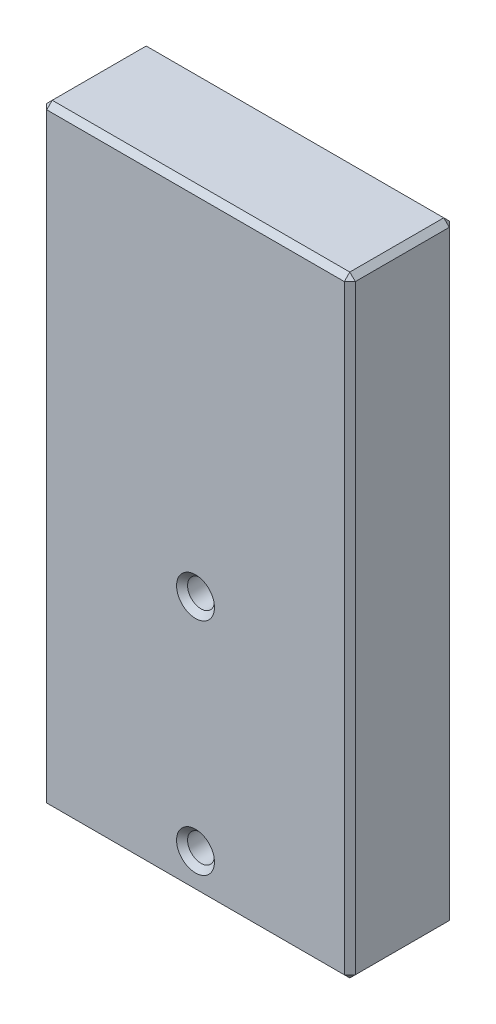
ISO-10303-21;
HEADER;
FILE_DESCRIPTION(('STEP AP214'),'2;1');
FILE_NAME('part.step','',(''),(''),'','','');
FILE_SCHEMA(('AUTOMOTIVE_DESIGN { 1 0 10303 214 1 1 1 1 }'));
ENDSEC;
DATA;
#1=APPLICATION_CONTEXT('core data for automotive mechanical design processes');
#2=APPLICATION_PROTOCOL_DEFINITION('international standard','automotive_design',2000,#1);
#3=PRODUCT_CONTEXT('',#1,'mechanical');
#4=PRODUCT('Part','Part','',(#3));
#5=PRODUCT_RELATED_PRODUCT_CATEGORY('part','',(#4));
#6=PRODUCT_DEFINITION_FORMATION('','',#4);
#7=PRODUCT_DEFINITION_CONTEXT('part definition',#1,'design');
#8=PRODUCT_DEFINITION('design','',#6,#7);
#9=PRODUCT_DEFINITION_SHAPE('','',#8);
#10=(LENGTH_UNIT() NAMED_UNIT(*) SI_UNIT(.MILLI.,.METRE.));
#11=(NAMED_UNIT(*) PLANE_ANGLE_UNIT() SI_UNIT($,.RADIAN.));
#12=(NAMED_UNIT(*) SI_UNIT($,.STERADIAN.) SOLID_ANGLE_UNIT());
#13=UNCERTAINTY_MEASURE_WITH_UNIT(LENGTH_MEASURE(1.E-05),#10,'distance_accuracy_value','');
#14=(GEOMETRIC_REPRESENTATION_CONTEXT(3) GLOBAL_UNCERTAINTY_ASSIGNED_CONTEXT((#13)) GLOBAL_UNIT_ASSIGNED_CONTEXT((#10,
#11,#12)) REPRESENTATION_CONTEXT('',''));
#15=CARTESIAN_POINT('',(0.,0.,0.));
#16=DIRECTION('',(0.,0.,1.));
#17=DIRECTION('',(1.,0.,0.));
#18=AXIS2_PLACEMENT_3D('',#15,#16,#17);
#19=CARTESIAN_POINT('',(0.,0.,9.525));
#20=DIRECTION('',(1.,0.,0.));
#21=DIRECTION('',(0.,0.,-1.));
#22=AXIS2_PLACEMENT_3D('',#19,#20,#21);
#23=PLANE('',#22);
#24=DIRECTION('',(0.,-1.,0.));
#25=VECTOR('',#24,1.);
#26=CARTESIAN_POINT('',(0.,0.,0.5));
#27=LINE('',#26,#25);
#28=CARTESIAN_POINT('',(0.,54.975,0.5));
#29=VERTEX_POINT('',#28);
#30=CARTESIAN_POINT('',(0.,0.5,0.5));
#31=VERTEX_POINT('',#30);
#32=EDGE_CURVE('E47',#29,#31,#27,.T.);
#33=ORIENTED_EDGE('',*,*,#32,.T.);
#34=DIRECTION('',(0.,0.,1.));
#35=VECTOR('',#34,1.);
#36=CARTESIAN_POINT('',(0.,0.5,9.525));
#37=LINE('',#36,#35);
#38=CARTESIAN_POINT('',(0.,0.5,9.025));
#39=VERTEX_POINT('',#38);
#40=EDGE_CURVE('E205',#31,#39,#37,.T.);
#41=ORIENTED_EDGE('',*,*,#40,.T.);
#42=DIRECTION('',(0.,1.,0.));
#43=VECTOR('',#42,1.);
#44=CARTESIAN_POINT('',(0.,0.,9.025));
#45=LINE('',#44,#43);
#46=CARTESIAN_POINT('',(0.,54.975,9.025));
#47=VERTEX_POINT('',#46);
#48=EDGE_CURVE('E201',#39,#47,#45,.T.);
#49=ORIENTED_EDGE('',*,*,#48,.T.);
#50=DIRECTION('',(0.,0.,-1.));
#51=VECTOR('',#50,1.);
#52=CARTESIAN_POINT('',(0.,54.975,9.525));
#53=LINE('',#52,#51);
#54=EDGE_CURVE('E52',#47,#29,#53,.T.);
#55=ORIENTED_EDGE('',*,*,#54,.T.);
#56=EDGE_LOOP('',(#33,#41,#49,#55));
#57=FACE_BOUND('',#56,.T.);
#58=ADVANCED_FACE('F32',(#57),#23,.F.);
#59=CARTESIAN_POINT('',(0.,0.,9.525));
#60=DIRECTION('',(0.,1.,0.));
#61=DIRECTION('',(0.,0.,1.));
#62=AXIS2_PLACEMENT_3D('',#59,#60,#61);
#63=PLANE('',#62);
#64=CARTESIAN_POINT('',(23.,0.,4.7625));
#65=DIRECTION('',(0.,1.,0.));
#66=DIRECTION('',(0.,0.,1.));
#67=AXIS2_PLACEMENT_3D('',#64,#65,#66);
#68=CIRCLE('',#67,1.71949999999999);
#69=CARTESIAN_POINT('',(23.,0.,6.48199999999999));
#70=VERTEX_POINT('',#69);
#71=EDGE_CURVE('E266',#70,#70,#68,.T.);
#72=ORIENTED_EDGE('',*,*,#71,.T.);
#73=EDGE_LOOP('',(#72));
#74=FACE_BOUND('',#73,.T.);
#75=CARTESIAN_POINT('',(5.,0.,4.7625));
#76=DIRECTION('',(0.,1.,0.));
#77=DIRECTION('',(0.,0.,1.));
#78=AXIS2_PLACEMENT_3D('',#75,#76,#77);
#79=CIRCLE('',#78,1.71949999999999);
#80=CARTESIAN_POINT('',(5.,0.,6.48199999999999));
#81=VERTEX_POINT('',#80);
#82=EDGE_CURVE('E263',#81,#81,#79,.T.);
#83=ORIENTED_EDGE('',*,*,#82,.T.);
#84=EDGE_LOOP('',(#83));
#85=FACE_BOUND('',#84,.T.);
#86=DIRECTION('',(0.,0.,-1.));
#87=VECTOR('',#86,1.);
#88=CARTESIAN_POINT('',(0.499999999999994,0.,9.525));
#89=LINE('',#88,#87);
#90=CARTESIAN_POINT('',(0.499999999999994,0.,9.025));
#91=VERTEX_POINT('',#90);
#92=CARTESIAN_POINT('',(0.499999999999994,0.,0.499999999999994));
#93=VERTEX_POINT('',#92);
#94=EDGE_CURVE('E125',#91,#93,#89,.T.);
#95=ORIENTED_EDGE('',*,*,#94,.T.);
#96=DIRECTION('',(1.,0.,0.));
#97=VECTOR('',#96,1.);
#98=CARTESIAN_POINT('',(28.,0.,0.499999999999994));
#99=LINE('',#98,#97);
#100=CARTESIAN_POINT('',(27.5,0.,0.499999999999994));
#101=VERTEX_POINT('',#100);
#102=EDGE_CURVE('E164',#93,#101,#99,.T.);
#103=ORIENTED_EDGE('',*,*,#102,.T.);
#104=DIRECTION('',(0.,0.,1.));
#105=VECTOR('',#104,1.);
#106=CARTESIAN_POINT('',(27.5,0.,9.525));
#107=LINE('',#106,#105);
#108=CARTESIAN_POINT('',(27.5,0.,9.025));
#109=VERTEX_POINT('',#108);
#110=EDGE_CURVE('E128',#101,#109,#107,.T.);
#111=ORIENTED_EDGE('',*,*,#110,.T.);
#112=DIRECTION('',(-1.,0.,0.));
#113=VECTOR('',#112,1.);
#114=CARTESIAN_POINT('',(0.,0.,9.025));
#115=LINE('',#114,#113);
#116=EDGE_CURVE('E120',#109,#91,#115,.T.);
#117=ORIENTED_EDGE('',*,*,#116,.T.);
#118=EDGE_LOOP('',(#95,#103,#111,#117));
#119=FACE_BOUND('',#118,.T.);
#120=ADVANCED_FACE('F122',(#74,#85,#119),#63,.F.);
#121=CARTESIAN_POINT('',(28.,0.,9.525));
#122=DIRECTION('',(-1.,0.,0.));
#123=DIRECTION('',(0.,0.,1.));
#124=AXIS2_PLACEMENT_3D('',#121,#122,#123);
#125=PLANE('',#124);
#126=DIRECTION('',(0.,-1.,0.));
#127=VECTOR('',#126,1.);
#128=CARTESIAN_POINT('',(28.,0.,9.025));
#129=LINE('',#128,#127);
#130=CARTESIAN_POINT('',(28.,54.975,9.025));
#131=VERTEX_POINT('',#130);
#132=CARTESIAN_POINT('',(28.,0.499999999999993,9.025));
#133=VERTEX_POINT('',#132);
#134=EDGE_CURVE('E175',#131,#133,#129,.T.);
#135=ORIENTED_EDGE('',*,*,#134,.T.);
#136=DIRECTION('',(0.,0.,-1.));
#137=VECTOR('',#136,1.);
#138=CARTESIAN_POINT('',(28.,0.499999999999993,9.525));
#139=LINE('',#138,#137);
#140=CARTESIAN_POINT('',(28.,0.499999999999993,0.499999999999994));
#141=VERTEX_POINT('',#140);
#142=EDGE_CURVE('E181',#133,#141,#139,.T.);
#143=ORIENTED_EDGE('',*,*,#142,.T.);
#144=DIRECTION('',(0.,1.,0.));
#145=VECTOR('',#144,1.);
#146=CARTESIAN_POINT('',(28.,55.475,0.499999999999994));
#147=LINE('',#146,#145);
#148=CARTESIAN_POINT('',(28.,54.975,0.499999999999994));
#149=VERTEX_POINT('',#148);
#150=EDGE_CURVE('E179',#141,#149,#147,.T.);
#151=ORIENTED_EDGE('',*,*,#150,.T.);
#152=DIRECTION('',(0.,0.,1.));
#153=VECTOR('',#152,1.);
#154=CARTESIAN_POINT('',(28.,54.975,9.525));
#155=LINE('',#154,#153);
#156=EDGE_CURVE('E177',#149,#131,#155,.T.);
#157=ORIENTED_EDGE('',*,*,#156,.T.);
#158=EDGE_LOOP('',(#135,#143,#151,#157));
#159=FACE_BOUND('',#158,.T.);
#160=ADVANCED_FACE('F321',(#159),#125,.F.);
#161=CARTESIAN_POINT('',(0.,55.475,9.525));
#162=DIRECTION('',(0.,-1.,0.));
#163=DIRECTION('',(0.,0.,-1.));
#164=AXIS2_PLACEMENT_3D('',#161,#162,#163);
#165=PLANE('',#164);
#166=DIRECTION('',(0.,0.,-1.));
#167=VECTOR('',#166,1.);
#168=CARTESIAN_POINT('',(27.5,55.475,9.525));
#169=LINE('',#168,#167);
#170=CARTESIAN_POINT('',(27.5,55.475,9.025));
#171=VERTEX_POINT('',#170);
#172=CARTESIAN_POINT('',(27.5,55.475,0.499999999999994));
#173=VERTEX_POINT('',#172);
#174=EDGE_CURVE('E188',#171,#173,#169,.T.);
#175=ORIENTED_EDGE('',*,*,#174,.T.);
#176=DIRECTION('',(-1.,0.,0.));
#177=VECTOR('',#176,1.);
#178=CARTESIAN_POINT('',(0.,55.475,0.499999999999994));
#179=LINE('',#178,#177);
#180=CARTESIAN_POINT('',(0.499999999999994,55.475,0.499999999999994));
#181=VERTEX_POINT('',#180);
#182=EDGE_CURVE('E190',#173,#181,#179,.T.);
#183=ORIENTED_EDGE('',*,*,#182,.T.);
#184=DIRECTION('',(0.,0.,1.));
#185=VECTOR('',#184,1.);
#186=CARTESIAN_POINT('',(0.499999999999994,55.475,9.525));
#187=LINE('',#186,#185);
#188=CARTESIAN_POINT('',(0.499999999999994,55.475,9.025));
#189=VERTEX_POINT('',#188);
#190=EDGE_CURVE('E184',#181,#189,#187,.T.);
#191=ORIENTED_EDGE('',*,*,#190,.T.);
#192=DIRECTION('',(1.,0.,0.));
#193=VECTOR('',#192,1.);
#194=CARTESIAN_POINT('',(0.,55.475,9.025));
#195=LINE('',#194,#193);
#196=EDGE_CURVE('E186',#189,#171,#195,.T.);
#197=ORIENTED_EDGE('',*,*,#196,.T.);
#198=EDGE_LOOP('',(#175,#183,#191,#197));
#199=FACE_BOUND('',#198,.T.);
#200=ADVANCED_FACE('F425',(#199),#165,.F.);
#201=CARTESIAN_POINT('',(0.,55.475,9.525));
#202=DIRECTION('',(0.,0.,-1.));
#203=DIRECTION('',(-1.,0.,0.));
#204=AXIS2_PLACEMENT_3D('',#201,#202,#203);
#205=PLANE('',#204);
#206=CARTESIAN_POINT('',(14.,3.475,9.525));
#207=DIRECTION('',(0.,0.,-1.));
#208=DIRECTION('',(-1.,0.,0.));
#209=AXIS2_PLACEMENT_3D('',#206,#207,#208);
#210=CIRCLE('',#209,1.71950000000003);
#211=CARTESIAN_POINT('',(12.2805,3.475,9.525));
#212=VERTEX_POINT('',#211);
#213=EDGE_CURVE('E11',#212,#212,#210,.T.);
#214=ORIENTED_EDGE('',*,*,#213,.T.);
#215=EDGE_LOOP('',(#214));
#216=FACE_BOUND('',#215,.T.);
#217=CARTESIAN_POINT('',(14.,23.475,9.525));
#218=DIRECTION('',(0.,0.,-1.));
#219=DIRECTION('',(-1.,0.,0.));
#220=AXIS2_PLACEMENT_3D('',#217,#218,#219);
#221=CIRCLE('',#220,1.71950000000003);
#222=CARTESIAN_POINT('',(12.2805,23.475,9.525));
#223=VERTEX_POINT('',#222);
#224=EDGE_CURVE('E40',#223,#223,#221,.T.);
#225=ORIENTED_EDGE('',*,*,#224,.T.);
#226=EDGE_LOOP('',(#225));
#227=FACE_BOUND('',#226,.T.);
#228=DIRECTION('',(1.,0.,0.));
#229=VECTOR('',#228,1.);
#230=CARTESIAN_POINT('',(0.,0.499999999999994,9.525));
#231=LINE('',#230,#229);
#232=CARTESIAN_POINT('',(0.499999999999994,0.499999999999994,9.525));
#233=VERTEX_POINT('',#232);
#234=CARTESIAN_POINT('',(27.5,0.499999999999994,9.525));
#235=VERTEX_POINT('',#234);
#236=EDGE_CURVE('E138',#233,#235,#231,.T.);
#237=ORIENTED_EDGE('',*,*,#236,.T.);
#238=DIRECTION('',(0.,1.,0.));
#239=VECTOR('',#238,1.);
#240=CARTESIAN_POINT('',(27.5,55.475,9.525));
#241=LINE('',#240,#239);
#242=CARTESIAN_POINT('',(27.5,54.975,9.525));
#243=VERTEX_POINT('',#242);
#244=EDGE_CURVE('E198',#235,#243,#241,.T.);
#245=ORIENTED_EDGE('',*,*,#244,.T.);
#246=DIRECTION('',(-1.,0.,0.));
#247=VECTOR('',#246,1.);
#248=CARTESIAN_POINT('',(0.,54.975,9.525));
#249=LINE('',#248,#247);
#250=CARTESIAN_POINT('',(0.499999999999994,54.975,9.525));
#251=VERTEX_POINT('',#250);
#252=EDGE_CURVE('E196',#243,#251,#249,.T.);
#253=ORIENTED_EDGE('',*,*,#252,.T.);
#254=DIRECTION('',(0.,-1.,0.));
#255=VECTOR('',#254,1.);
#256=CARTESIAN_POINT('',(0.499999999999994,55.475,9.525));
#257=LINE('',#256,#255);
#258=EDGE_CURVE('E193',#251,#233,#257,.T.);
#259=ORIENTED_EDGE('',*,*,#258,.T.);
#260=EDGE_LOOP('',(#237,#245,#253,#259));
#261=FACE_BOUND('',#260,.T.);
#262=ADVANCED_FACE('F292',(#216,#227,#261),#205,.F.);
#263=CARTESIAN_POINT('',(0.,55.475,0.));
#264=DIRECTION('',(0.,0.,-1.));
#265=DIRECTION('',(-1.,0.,0.));
#266=AXIS2_PLACEMENT_3D('',#263,#264,#265);
#267=PLANE('',#266);
#268=CARTESIAN_POINT('',(14.,3.475,0.));
#269=DIRECTION('',(0.,0.,-1.));
#270=DIRECTION('',(-1.,0.,0.));
#271=AXIS2_PLACEMENT_3D('',#268,#269,#270);
#272=CIRCLE('',#271,1.71949999999996);
#273=CARTESIAN_POINT('',(12.2805,3.475,0.));
#274=VERTEX_POINT('',#273);
#275=EDGE_CURVE('E275',#274,#274,#272,.F.);
#276=ORIENTED_EDGE('',*,*,#275,.T.);
#277=EDGE_LOOP('',(#276));
#278=FACE_BOUND('',#277,.T.);
#279=CARTESIAN_POINT('',(14.,23.475,0.));
#280=DIRECTION('',(0.,0.,-1.));
#281=DIRECTION('',(-1.,0.,0.));
#282=AXIS2_PLACEMENT_3D('',#279,#280,#281);
#283=CIRCLE('',#282,1.71949999999996);
#284=CARTESIAN_POINT('',(12.2805,23.475,0.));
#285=VERTEX_POINT('',#284);
#286=EDGE_CURVE('E272',#285,#285,#283,.F.);
#287=ORIENTED_EDGE('',*,*,#286,.T.);
#288=EDGE_LOOP('',(#287));
#289=FACE_BOUND('',#288,.T.);
#290=DIRECTION('',(0.,-1.,0.));
#291=VECTOR('',#290,1.);
#292=CARTESIAN_POINT('',(27.5,0.,0.));
#293=LINE('',#292,#291);
#294=CARTESIAN_POINT('',(27.5,54.975,0.));
#295=VERTEX_POINT('',#294);
#296=CARTESIAN_POINT('',(27.5,0.5,0.));
#297=VERTEX_POINT('',#296);
#298=EDGE_CURVE('E170',#295,#297,#293,.T.);
#299=ORIENTED_EDGE('',*,*,#298,.T.);
#300=DIRECTION('',(-1.,0.,0.));
#301=VECTOR('',#300,1.);
#302=CARTESIAN_POINT('',(0.,0.5,0.));
#303=LINE('',#302,#301);
#304=CARTESIAN_POINT('',(0.499999999999994,0.5,0.));
#305=VERTEX_POINT('',#304);
#306=EDGE_CURVE('E172',#297,#305,#303,.T.);
#307=ORIENTED_EDGE('',*,*,#306,.T.);
#308=DIRECTION('',(0.,1.,0.));
#309=VECTOR('',#308,1.);
#310=CARTESIAN_POINT('',(0.499999999999994,55.475,0.));
#311=LINE('',#310,#309);
#312=CARTESIAN_POINT('',(0.499999999999994,54.975,0.));
#313=VERTEX_POINT('',#312);
#314=EDGE_CURVE('E166',#305,#313,#311,.T.);
#315=ORIENTED_EDGE('',*,*,#314,.T.);
#316=DIRECTION('',(1.,0.,0.));
#317=VECTOR('',#316,1.);
#318=CARTESIAN_POINT('',(28.,54.975,0.));
#319=LINE('',#318,#317);
#320=EDGE_CURVE('E168',#313,#295,#319,.T.);
#321=ORIENTED_EDGE('',*,*,#320,.T.);
#322=EDGE_LOOP('',(#299,#307,#315,#321));
#323=FACE_BOUND('',#322,.T.);
#324=ADVANCED_FACE('F424',(#278,#289,#323),#267,.T.);
#325=CARTESIAN_POINT('',(5.,20.,4.7625));
#326=DIRECTION('',(0.,-1.,0.));
#327=DIRECTION('',(0.,0.,-1.));
#328=AXIS2_PLACEMENT_3D('',#325,#326,#327);
#329=CYLINDRICAL_SURFACE('',#328,1.2195);
#330=CARTESIAN_POINT('',(5.,0.49999999999999,4.7625));
#331=DIRECTION('',(0.,1.,0.));
#332=DIRECTION('',(0.,0.,1.));
#333=AXIS2_PLACEMENT_3D('',#330,#331,#332);
#334=CIRCLE('',#333,1.2195);
#335=CARTESIAN_POINT('',(5.,0.49999999999999,5.982));
#336=VERTEX_POINT('',#335);
#337=EDGE_CURVE('E269',#336,#336,#334,.F.);
#338=ORIENTED_EDGE('',*,*,#337,.T.);
#339=EDGE_LOOP('',(#338));
#340=FACE_BOUND('',#339,.T.);
#341=CARTESIAN_POINT('',(5.,20.,4.7625));
#342=DIRECTION('',(0.,-1.,0.));
#343=DIRECTION('',(0.,0.,-1.));
#344=AXIS2_PLACEMENT_3D('',#341,#342,#343);
#345=CIRCLE('',#344,1.2195);
#346=CARTESIAN_POINT('',(5.,20.,3.543));
#347=VERTEX_POINT('',#346);
#348=EDGE_CURVE('E156',#347,#347,#345,.T.);
#349=ORIENTED_EDGE('',*,*,#348,.F.);
#350=EDGE_LOOP('',(#349));
#351=FACE_BOUND('',#350,.T.);
#352=ADVANCED_FACE('F431',(#340,#351),#329,.F.);
#353=CARTESIAN_POINT('',(5.,20.,4.7625));
#354=DIRECTION('',(0.,-1.,0.));
#355=DIRECTION('',(0.,0.,-1.));
#356=AXIS2_PLACEMENT_3D('',#353,#354,#355);
#357=PLANE('',#356);
#358=ORIENTED_EDGE('',*,*,#348,.T.);
#359=EDGE_LOOP('',(#358));
#360=FACE_BOUND('',#359,.T.);
#361=ADVANCED_FACE('F628',(#360),#357,.T.);
#362=CARTESIAN_POINT('',(23.,20.,4.7625));
#363=DIRECTION('',(0.,-1.,0.));
#364=DIRECTION('',(0.,0.,-1.));
#365=AXIS2_PLACEMENT_3D('',#362,#363,#364);
#366=CYLINDRICAL_SURFACE('',#365,1.2195);
#367=CARTESIAN_POINT('',(23.,0.49999999999999,4.7625));
#368=DIRECTION('',(0.,1.,0.));
#369=DIRECTION('',(0.,0.,1.));
#370=AXIS2_PLACEMENT_3D('',#367,#368,#369);
#371=CIRCLE('',#370,1.2195);
#372=CARTESIAN_POINT('',(23.,0.49999999999999,5.982));
#373=VERTEX_POINT('',#372);
#374=EDGE_CURVE('E207',#373,#373,#371,.F.);
#375=ORIENTED_EDGE('',*,*,#374,.T.);
#376=EDGE_LOOP('',(#375));
#377=FACE_BOUND('',#376,.T.);
#378=CARTESIAN_POINT('',(23.,20.,4.7625));
#379=DIRECTION('',(0.,-1.,0.));
#380=DIRECTION('',(0.,0.,-1.));
#381=AXIS2_PLACEMENT_3D('',#378,#379,#380);
#382=CIRCLE('',#381,1.2195);
#383=CARTESIAN_POINT('',(23.,20.,3.543));
#384=VERTEX_POINT('',#383);
#385=EDGE_CURVE('E159',#384,#384,#382,.T.);
#386=ORIENTED_EDGE('',*,*,#385,.F.);
#387=EDGE_LOOP('',(#386));
#388=FACE_BOUND('',#387,.T.);
#389=ADVANCED_FACE('F313',(#377,#388),#366,.F.);
#390=CARTESIAN_POINT('',(23.,20.,4.7625));
#391=DIRECTION('',(0.,-1.,0.));
#392=DIRECTION('',(0.,0.,-1.));
#393=AXIS2_PLACEMENT_3D('',#390,#391,#392);
#394=PLANE('',#393);
#395=ORIENTED_EDGE('',*,*,#385,.T.);
#396=EDGE_LOOP('',(#395));
#397=FACE_BOUND('',#396,.T.);
#398=ADVANCED_FACE('F303',(#397),#394,.T.);
#399=CARTESIAN_POINT('',(14.,23.475,0.));
#400=DIRECTION('',(0.,0.,1.));
#401=DIRECTION('',(1.,0.,0.));
#402=AXIS2_PLACEMENT_3D('',#399,#400,#401);
#403=CYLINDRICAL_SURFACE('',#402,1.2195);
#404=CARTESIAN_POINT('',(14.,23.475,0.499999999999958));
#405=DIRECTION('',(0.,0.,-1.));
#406=DIRECTION('',(-1.,0.,0.));
#407=AXIS2_PLACEMENT_3D('',#404,#405,#406);
#408=CIRCLE('',#407,1.2195);
#409=CARTESIAN_POINT('',(15.2195,23.475,0.499999999999958));
#410=VERTEX_POINT('',#409);
#411=EDGE_CURVE('E287',#410,#410,#408,.T.);
#412=CARTESIAN_POINT('',(14.,23.475,9.02499999999997));
#413=DIRECTION('',(0.,0.,-1.));
#414=DIRECTION('',(-1.,0.,0.));
#415=AXIS2_PLACEMENT_3D('',#412,#413,#414);
#416=CIRCLE('',#415,1.2195);
#417=CARTESIAN_POINT('',(15.2195,23.475,9.02499999999997));
#418=VERTEX_POINT('',#417);
#419=EDGE_CURVE('E284',#418,#418,#416,.F.);
#420=CARTESIAN_POINT('',(15.2195,23.475,0.499999999999958));
#421=CARTESIAN_POINT('',(15.2195,23.475,0.588802083333291));
#422=CARTESIAN_POINT('',(15.2195,23.475,0.677604166666625));
#423=CARTESIAN_POINT('',(15.2195,23.475,0.855208333333292));
#424=CARTESIAN_POINT('',(15.2195,23.475,0.944010416666625));
#425=CARTESIAN_POINT('',(15.2195,23.475,1.12161458333329));
#426=CARTESIAN_POINT('',(15.2195,23.475,1.21041666666663));
#427=CARTESIAN_POINT('',(15.2195,23.475,1.38802083333329));
#428=CARTESIAN_POINT('',(15.2195,23.475,1.47682291666663));
#429=CARTESIAN_POINT('',(15.2195,23.475,1.65442708333329));
#430=CARTESIAN_POINT('',(15.2195,23.475,1.74322916666663));
#431=CARTESIAN_POINT('',(15.2195,23.475,1.92083333333329));
#432=CARTESIAN_POINT('',(15.2195,23.475,2.00963541666663));
#433=CARTESIAN_POINT('',(15.2195,23.475,2.18723958333329));
#434=CARTESIAN_POINT('',(15.2195,23.475,2.27604166666663));
#435=CARTESIAN_POINT('',(15.2195,23.475,2.45364583333329));
#436=CARTESIAN_POINT('',(15.2195,23.475,2.54244791666663));
#437=CARTESIAN_POINT('',(15.2195,23.475,2.72005208333329));
#438=CARTESIAN_POINT('',(15.2195,23.475,2.80885416666663));
#439=CARTESIAN_POINT('',(15.2195,23.475,2.9864583333333));
#440=CARTESIAN_POINT('',(15.2195,23.475,3.07526041666663));
#441=CARTESIAN_POINT('',(15.2195,23.475,3.2528645833333));
#442=CARTESIAN_POINT('',(15.2195,23.475,3.34166666666663));
#443=CARTESIAN_POINT('',(15.2195,23.475,3.5192708333333));
#444=CARTESIAN_POINT('',(15.2195,23.475,3.60807291666663));
#445=CARTESIAN_POINT('',(15.2195,23.475,3.7856770833333));
#446=CARTESIAN_POINT('',(15.2195,23.475,3.87447916666663));
#447=CARTESIAN_POINT('',(15.2195,23.475,4.0520833333333));
#448=CARTESIAN_POINT('',(15.2195,23.475,4.14088541666663));
#449=CARTESIAN_POINT('',(15.2195,23.475,4.3184895833333));
#450=CARTESIAN_POINT('',(15.2195,23.475,4.40729166666663));
#451=CARTESIAN_POINT('',(15.2195,23.475,4.5848958333333));
#452=CARTESIAN_POINT('',(15.2195,23.475,4.67369791666663));
#453=CARTESIAN_POINT('',(15.2195,23.475,4.8513020833333));
#454=CARTESIAN_POINT('',(15.2195,23.475,4.94010416666663));
#455=CARTESIAN_POINT('',(15.2195,23.475,5.1177083333333));
#456=CARTESIAN_POINT('',(15.2195,23.475,5.20651041666663));
#457=CARTESIAN_POINT('',(15.2195,23.475,5.3841145833333));
#458=CARTESIAN_POINT('',(15.2195,23.475,5.47291666666663));
#459=CARTESIAN_POINT('',(15.2195,23.475,5.6505208333333));
#460=CARTESIAN_POINT('',(15.2195,23.475,5.73932291666663));
#461=CARTESIAN_POINT('',(15.2195,23.475,5.9169270833333));
#462=CARTESIAN_POINT('',(15.2195,23.475,6.00572916666663));
#463=CARTESIAN_POINT('',(15.2195,23.475,6.1833333333333));
#464=CARTESIAN_POINT('',(15.2195,23.475,6.27213541666663));
#465=CARTESIAN_POINT('',(15.2195,23.475,6.4497395833333));
#466=CARTESIAN_POINT('',(15.2195,23.475,6.53854166666663));
#467=CARTESIAN_POINT('',(15.2195,23.475,6.7161458333333));
#468=CARTESIAN_POINT('',(15.2195,23.475,6.80494791666664));
#469=CARTESIAN_POINT('',(15.2195,23.475,6.9825520833333));
#470=CARTESIAN_POINT('',(15.2195,23.475,7.07135416666664));
#471=CARTESIAN_POINT('',(15.2195,23.475,7.2489583333333));
#472=CARTESIAN_POINT('',(15.2195,23.475,7.33776041666664));
#473=CARTESIAN_POINT('',(15.2195,23.475,7.5153645833333));
#474=CARTESIAN_POINT('',(15.2195,23.475,7.60416666666664));
#475=CARTESIAN_POINT('',(15.2195,23.475,7.7817708333333));
#476=CARTESIAN_POINT('',(15.2195,23.475,7.87057291666664));
#477=CARTESIAN_POINT('',(15.2195,23.475,8.0481770833333));
#478=CARTESIAN_POINT('',(15.2195,23.475,8.13697916666664));
#479=CARTESIAN_POINT('',(15.2195,23.475,8.3145833333333));
#480=CARTESIAN_POINT('',(15.2195,23.475,8.40338541666664));
#481=CARTESIAN_POINT('',(15.2195,23.475,8.58098958333331));
#482=CARTESIAN_POINT('',(15.2195,23.475,8.66979166666664));
#483=CARTESIAN_POINT('',(15.2195,23.475,8.84739583333331));
#484=CARTESIAN_POINT('',(15.2195,23.475,8.93619791666664));
#485=CARTESIAN_POINT('',(15.2195,23.475,9.02499999999997));
#486=B_SPLINE_CURVE_WITH_KNOTS('',3,(#420,#421,#422,#423,#424,#425,#426,#427,#428,#429,#430,
#431,#432,#433,#434,#435,#436,#437,#438,#439,#440,#441,#442,#443,#444,#445,#446,#447,#448,#449,
#450,#451,#452,#453,#454,#455,#456,#457,#458,#459,#460,#461,#462,#463,#464,#465,#466,#467,#468,
#469,#470,#471,#472,#473,#474,#475,#476,#477,#478,#479,#480,#481,#482,#483,#484,#485),
.UNSPECIFIED.,.F.,.F.,(4,2,2,2,2,2,2,2,2,2,2,2,2,2,2,2,2,2,2,2,2,2,2,2,2,2,2,2,2,2,2,2,4),(0.,
0.26640625,0.532812500000001,0.799218750000001,1.065625,1.33203125,1.5984375,1.86484375,2.13125,
2.39765625,2.6640625,2.93046875000001,3.19687500000001,3.46328125000001,3.72968750000001,
3.99609375000001,4.26250000000001,4.52890625000001,4.79531250000001,5.06171875000001,
5.32812500000001,5.59453125000001,5.86093750000001,6.12734375000001,6.39375000000001,
6.66015625000001,6.92656250000001,7.19296875000001,7.45937500000001,7.72578125000001,
7.99218750000002,8.25859375000002,8.52500000000001),.UNSPECIFIED.);
#487=EDGE_CURVE('BSEAM300',#410,#418,#486,.T.);
#488=ORIENTED_EDGE('',*,*,#411,.T.);
#489=ORIENTED_EDGE('',*,*,#419,.T.);
#490=ORIENTED_EDGE('',*,*,#487,.T.);
#491=ORIENTED_EDGE('',*,*,#487,.F.);
#492=EDGE_LOOP('',(#488,#490,#489,#491));
#493=FACE_BOUND('',#492,.T.);
#494=ADVANCED_FACE('F300',(#493),#403,.F.);
#495=CARTESIAN_POINT('',(14.,3.475,0.));
#496=DIRECTION('',(0.,0.,1.));
#497=DIRECTION('',(1.,0.,0.));
#498=AXIS2_PLACEMENT_3D('',#495,#496,#497);
#499=CYLINDRICAL_SURFACE('',#498,1.2195);
#500=CARTESIAN_POINT('',(14.,3.475,0.499999999999959));
#501=DIRECTION('',(0.,0.,-1.));
#502=DIRECTION('',(-1.,0.,0.));
#503=AXIS2_PLACEMENT_3D('',#500,#501,#502);
#504=CIRCLE('',#503,1.2195);
#505=CARTESIAN_POINT('',(15.2195,3.475,0.499999999999959));
#506=VERTEX_POINT('',#505);
#507=EDGE_CURVE('E281',#506,#506,#504,.T.);
#508=CARTESIAN_POINT('',(14.,3.475,9.02499999999997));
#509=DIRECTION('',(0.,0.,-1.));
#510=DIRECTION('',(-1.,0.,0.));
#511=AXIS2_PLACEMENT_3D('',#508,#509,#510);
#512=CIRCLE('',#511,1.2195);
#513=CARTESIAN_POINT('',(15.2195,3.475,9.02499999999997));
#514=VERTEX_POINT('',#513);
#515=EDGE_CURVE('E278',#514,#514,#512,.F.);
#516=CARTESIAN_POINT('',(15.2195,3.475,0.499999999999959));
#517=CARTESIAN_POINT('',(15.2195,3.475,0.588802083333293));
#518=CARTESIAN_POINT('',(15.2195,3.475,0.677604166666626));
#519=CARTESIAN_POINT('',(15.2195,3.475,0.855208333333293));
#520=CARTESIAN_POINT('',(15.2195,3.475,0.944010416666627));
#521=CARTESIAN_POINT('',(15.2195,3.475,1.12161458333329));
#522=CARTESIAN_POINT('',(15.2195,3.475,1.21041666666663));
#523=CARTESIAN_POINT('',(15.2195,3.475,1.38802083333329));
#524=CARTESIAN_POINT('',(15.2195,3.475,1.47682291666663));
#525=CARTESIAN_POINT('',(15.2195,3.475,1.65442708333329));
#526=CARTESIAN_POINT('',(15.2195,3.475,1.74322916666663));
#527=CARTESIAN_POINT('',(15.2195,3.475,1.92083333333329));
#528=CARTESIAN_POINT('',(15.2195,3.475,2.00963541666663));
#529=CARTESIAN_POINT('',(15.2195,3.475,2.1872395833333));
#530=CARTESIAN_POINT('',(15.2195,3.475,2.27604166666663));
#531=CARTESIAN_POINT('',(15.2195,3.475,2.4536458333333));
#532=CARTESIAN_POINT('',(15.2195,3.475,2.54244791666663));
#533=CARTESIAN_POINT('',(15.2195,3.475,2.7200520833333));
#534=CARTESIAN_POINT('',(15.2195,3.475,2.80885416666663));
#535=CARTESIAN_POINT('',(15.2195,3.475,2.9864583333333));
#536=CARTESIAN_POINT('',(15.2195,3.475,3.07526041666663));
#537=CARTESIAN_POINT('',(15.2195,3.475,3.2528645833333));
#538=CARTESIAN_POINT('',(15.2195,3.475,3.34166666666663));
#539=CARTESIAN_POINT('',(15.2195,3.475,3.5192708333333));
#540=CARTESIAN_POINT('',(15.2195,3.475,3.60807291666663));
#541=CARTESIAN_POINT('',(15.2195,3.475,3.7856770833333));
#542=CARTESIAN_POINT('',(15.2195,3.475,3.87447916666663));
#543=CARTESIAN_POINT('',(15.2195,3.475,4.0520833333333));
#544=CARTESIAN_POINT('',(15.2195,3.475,4.14088541666663));
#545=CARTESIAN_POINT('',(15.2195,3.475,4.3184895833333));
#546=CARTESIAN_POINT('',(15.2195,3.475,4.40729166666663));
#547=CARTESIAN_POINT('',(15.2195,3.475,4.5848958333333));
#548=CARTESIAN_POINT('',(15.2195,3.475,4.67369791666663));
#549=CARTESIAN_POINT('',(15.2195,3.475,4.8513020833333));
#550=CARTESIAN_POINT('',(15.2195,3.475,4.94010416666663));
#551=CARTESIAN_POINT('',(15.2195,3.475,5.1177083333333));
#552=CARTESIAN_POINT('',(15.2195,3.475,5.20651041666663));
#553=CARTESIAN_POINT('',(15.2195,3.475,5.3841145833333));
#554=CARTESIAN_POINT('',(15.2195,3.475,5.47291666666663));
#555=CARTESIAN_POINT('',(15.2195,3.475,5.6505208333333));
#556=CARTESIAN_POINT('',(15.2195,3.475,5.73932291666663));
#557=CARTESIAN_POINT('',(15.2195,3.475,5.9169270833333));
#558=CARTESIAN_POINT('',(15.2195,3.475,6.00572916666664));
#559=CARTESIAN_POINT('',(15.2195,3.475,6.1833333333333));
#560=CARTESIAN_POINT('',(15.2195,3.475,6.27213541666664));
#561=CARTESIAN_POINT('',(15.2195,3.475,6.4497395833333));
#562=CARTESIAN_POINT('',(15.2195,3.475,6.53854166666664));
#563=CARTESIAN_POINT('',(15.2195,3.475,6.7161458333333));
#564=CARTESIAN_POINT('',(15.2195,3.475,6.80494791666664));
#565=CARTESIAN_POINT('',(15.2195,3.475,6.9825520833333));
#566=CARTESIAN_POINT('',(15.2195,3.475,7.07135416666664));
#567=CARTESIAN_POINT('',(15.2195,3.475,7.2489583333333));
#568=CARTESIAN_POINT('',(15.2195,3.475,7.33776041666664));
#569=CARTESIAN_POINT('',(15.2195,3.475,7.5153645833333));
#570=CARTESIAN_POINT('',(15.2195,3.475,7.60416666666664));
#571=CARTESIAN_POINT('',(15.2195,3.475,7.7817708333333));
#572=CARTESIAN_POINT('',(15.2195,3.475,7.87057291666664));
#573=CARTESIAN_POINT('',(15.2195,3.475,8.0481770833333));
#574=CARTESIAN_POINT('',(15.2195,3.475,8.13697916666664));
#575=CARTESIAN_POINT('',(15.2195,3.475,8.31458333333331));
#576=CARTESIAN_POINT('',(15.2195,3.475,8.40338541666664));
#577=CARTESIAN_POINT('',(15.2195,3.475,8.58098958333331));
#578=CARTESIAN_POINT('',(15.2195,3.475,8.66979166666664));
#579=CARTESIAN_POINT('',(15.2195,3.475,8.84739583333331));
#580=CARTESIAN_POINT('',(15.2195,3.475,8.93619791666664));
#581=CARTESIAN_POINT('',(15.2195,3.475,9.02499999999997));
#582=B_SPLINE_CURVE_WITH_KNOTS('',3,(#516,#517,#518,#519,#520,#521,#522,#523,#524,#525,#526,
#527,#528,#529,#530,#531,#532,#533,#534,#535,#536,#537,#538,#539,#540,#541,#542,#543,#544,#545,
#546,#547,#548,#549,#550,#551,#552,#553,#554,#555,#556,#557,#558,#559,#560,#561,#562,#563,#564,
#565,#566,#567,#568,#569,#570,#571,#572,#573,#574,#575,#576,#577,#578,#579,#580,#581),
.UNSPECIFIED.,.F.,.F.,(4,2,2,2,2,2,2,2,2,2,2,2,2,2,2,2,2,2,2,2,2,2,2,2,2,2,2,2,2,2,2,2,4),(0.,
0.26640625,0.532812500000001,0.799218750000001,1.065625,1.33203125,1.5984375,1.86484375,2.13125,
2.39765625,2.6640625,2.93046875000001,3.19687500000001,3.46328125000001,3.72968750000001,
3.99609375000001,4.26250000000001,4.52890625000001,4.79531250000001,5.06171875000001,
5.32812500000001,5.59453125000001,5.86093750000001,6.12734375000001,6.39375000000001,
6.66015625000001,6.92656250000001,7.19296875000001,7.45937500000001,7.72578125000001,
7.99218750000001,8.25859375000001,8.52500000000001),.UNSPECIFIED.);
#583=EDGE_CURVE('BSEAM302',#506,#514,#582,.T.);
#584=ORIENTED_EDGE('',*,*,#507,.T.);
#585=ORIENTED_EDGE('',*,*,#515,.T.);
#586=ORIENTED_EDGE('',*,*,#583,.T.);
#587=ORIENTED_EDGE('',*,*,#583,.F.);
#588=EDGE_LOOP('',(#584,#586,#585,#587));
#589=FACE_BOUND('',#588,.T.);
#590=ADVANCED_FACE('F302',(#589),#499,.F.);
#591=CARTESIAN_POINT('',(0.,54.975,9.525));
#592=DIRECTION('',(0.,-0.707106781186552,-0.707106781186543));
#593=DIRECTION('',(0.,0.707106781186543,-0.707106781186552));
#594=AXIS2_PLACEMENT_3D('',#591,#592,#593);
#595=PLANE('',#594);
#596=DIRECTION('',(0.,-0.707106781186543,0.707106781186552));
#597=VECTOR('',#596,1.);
#598=CARTESIAN_POINT('',(0.499999999999994,54.975,9.525));
#599=LINE('',#598,#597);
#600=EDGE_CURVE('E258',#251,#189,#599,.F.);
#601=ORIENTED_EDGE('',*,*,#600,.F.);
#602=ORIENTED_EDGE('',*,*,#252,.F.);
#603=DIRECTION('',(0.,0.707106781186543,-0.707106781186552));
#604=VECTOR('',#603,1.);
#605=CARTESIAN_POINT('',(27.5,55.225,9.275));
#606=LINE('',#605,#604);
#607=EDGE_CURVE('E255',#171,#243,#606,.F.);
#608=ORIENTED_EDGE('',*,*,#607,.F.);
#609=ORIENTED_EDGE('',*,*,#196,.F.);
#610=EDGE_LOOP('',(#601,#602,#608,#609));
#611=FACE_BOUND('',#610,.T.);
#612=ADVANCED_FACE('F310',(#611),#595,.F.);
#613=CARTESIAN_POINT('',(0.499999999999994,54.975,9.525));
#614=DIRECTION('',(-0.577350269189634,0.577350269189626,0.577350269189618));
#615=DIRECTION('',(-0.707106781186543,-0.707106781186552,0.));
#616=AXIS2_PLACEMENT_3D('',#613,#614,#615);
#617=PLANE('',#616);
#618=DIRECTION('',(-0.707106781186543,0.,-0.707106781186552));
#619=VECTOR('',#618,1.);
#620=CARTESIAN_POINT('',(0.499999999999994,54.975,9.525));
#621=LINE('',#620,#619);
#622=EDGE_CURVE('E249',#251,#47,#621,.T.);
#623=ORIENTED_EDGE('',*,*,#622,.F.);
#624=ORIENTED_EDGE('',*,*,#600,.T.);
#625=DIRECTION('',(0.707106781186543,0.707106781186552,0.));
#626=VECTOR('',#625,1.);
#627=CARTESIAN_POINT('',(0.249999999999997,55.225,9.025));
#628=LINE('',#627,#626);
#629=EDGE_CURVE('E252',#47,#189,#628,.T.);
#630=ORIENTED_EDGE('',*,*,#629,.F.);
#631=EDGE_LOOP('',(#623,#624,#630));
#632=FACE_BOUND('',#631,.T.);
#633=ADVANCED_FACE('F392',(#632),#617,.T.);
#634=CARTESIAN_POINT('',(28.,54.975,9.025));
#635=DIRECTION('',(0.577350269189634,0.577350269189626,0.577350269189618));
#636=DIRECTION('',(-0.707106781186543,0.707106781186552,0.));
#637=AXIS2_PLACEMENT_3D('',#634,#635,#636);
#638=PLANE('',#637);
#639=DIRECTION('',(0.707106781186543,-0.707106781186552,0.));
#640=VECTOR('',#639,1.);
#641=CARTESIAN_POINT('',(28.,54.975,9.025));
#642=LINE('',#641,#640);
#643=EDGE_CURVE('E244',#171,#131,#642,.T.);
#644=ORIENTED_EDGE('',*,*,#643,.F.);
#645=ORIENTED_EDGE('',*,*,#607,.T.);
#646=DIRECTION('',(-0.707106781186543,0.,0.707106781186552));
#647=VECTOR('',#646,1.);
#648=CARTESIAN_POINT('',(28.,54.975,9.025));
#649=LINE('',#648,#647);
#650=EDGE_CURVE('E247',#131,#243,#649,.T.);
#651=ORIENTED_EDGE('',*,*,#650,.F.);
#652=EDGE_LOOP('',(#644,#645,#651));
#653=FACE_BOUND('',#652,.T.);
#654=ADVANCED_FACE('F388',(#653),#638,.T.);
#655=CARTESIAN_POINT('',(0.,54.975,9.525));
#656=DIRECTION('',(0.707106781186552,-0.707106781186543,0.));
#657=DIRECTION('',(0.707106781186543,0.707106781186552,0.));
#658=AXIS2_PLACEMENT_3D('',#655,#656,#657);
#659=PLANE('',#658);
#660=ORIENTED_EDGE('',*,*,#629,.T.);
#661=ORIENTED_EDGE('',*,*,#190,.F.);
#662=DIRECTION('',(-0.707106781186543,-0.707106781186552,0.));
#663=VECTOR('',#662,1.);
#664=CARTESIAN_POINT('',(0.499999999999994,55.475,0.499999999999994));
#665=LINE('',#664,#663);
#666=EDGE_CURVE('E239',#29,#181,#665,.F.);
#667=ORIENTED_EDGE('',*,*,#666,.F.);
#668=ORIENTED_EDGE('',*,*,#54,.F.);
#669=EDGE_LOOP('',(#660,#661,#667,#668));
#670=FACE_BOUND('',#669,.T.);
#671=ADVANCED_FACE('F384',(#670),#659,.F.);
#672=CARTESIAN_POINT('',(0.499999999999994,55.475,9.525));
#673=DIRECTION('',(0.707106781186552,0.,-0.707106781186543));
#674=DIRECTION('',(-0.707106781186543,0.,-0.707106781186552));
#675=AXIS2_PLACEMENT_3D('',#672,#673,#674);
#676=PLANE('',#675);
#677=ORIENTED_EDGE('',*,*,#622,.T.);
#678=ORIENTED_EDGE('',*,*,#48,.F.);
#679=DIRECTION('',(0.707106781186543,0.,0.707106781186552));
#680=VECTOR('',#679,1.);
#681=CARTESIAN_POINT('',(0.249999999999997,0.499999999999997,9.275));
#682=LINE('',#681,#680);
#683=EDGE_CURVE('E142',#233,#39,#682,.F.);
#684=ORIENTED_EDGE('',*,*,#683,.F.);
#685=ORIENTED_EDGE('',*,*,#258,.F.);
#686=EDGE_LOOP('',(#677,#678,#684,#685));
#687=FACE_BOUND('',#686,.T.);
#688=ADVANCED_FACE('F381',(#687),#676,.F.);
#689=CARTESIAN_POINT('',(0.,0.499999999999994,9.525));
#690=DIRECTION('',(0.,0.707106781186552,-0.707106781186543));
#691=DIRECTION('',(0.,0.707106781186543,0.707106781186552));
#692=AXIS2_PLACEMENT_3D('',#689,#690,#691);
#693=PLANE('',#692);
#694=DIRECTION('',(0.,0.707106781186543,0.707106781186552));
#695=VECTOR('',#694,1.);
#696=CARTESIAN_POINT('',(27.5,0.,9.025));
#697=LINE('',#696,#695);
#698=EDGE_CURVE('E143',#235,#109,#697,.F.);
#699=ORIENTED_EDGE('',*,*,#698,.F.);
#700=ORIENTED_EDGE('',*,*,#236,.F.);
#701=DIRECTION('',(0.,-0.707106781186543,-0.707106781186552));
#702=VECTOR('',#701,1.);
#703=CARTESIAN_POINT('',(0.499999999999994,0.,9.025));
#704=LINE('',#703,#702);
#705=EDGE_CURVE('E135',#91,#233,#704,.F.);
#706=ORIENTED_EDGE('',*,*,#705,.F.);
#707=ORIENTED_EDGE('',*,*,#116,.F.);
#708=EDGE_LOOP('',(#699,#700,#706,#707));
#709=FACE_BOUND('',#708,.T.);
#710=ADVANCED_FACE('F137',(#709),#693,.F.);
#711=CARTESIAN_POINT('',(27.5,55.475,9.525));
#712=DIRECTION('',(-0.707106781186552,0.,-0.707106781186543));
#713=DIRECTION('',(-0.707106781186543,0.,0.707106781186552));
#714=AXIS2_PLACEMENT_3D('',#711,#712,#713);
#715=PLANE('',#714);
#716=ORIENTED_EDGE('',*,*,#650,.T.);
#717=ORIENTED_EDGE('',*,*,#244,.F.);
#718=DIRECTION('',(0.707106781186543,0.,-0.707106781186552));
#719=VECTOR('',#718,1.);
#720=CARTESIAN_POINT('',(27.75,0.499999999999993,9.275));
#721=LINE('',#720,#719);
#722=EDGE_CURVE('E234',#133,#235,#721,.F.);
#723=ORIENTED_EDGE('',*,*,#722,.F.);
#724=ORIENTED_EDGE('',*,*,#134,.F.);
#725=EDGE_LOOP('',(#716,#717,#723,#724));
#726=FACE_BOUND('',#725,.T.);
#727=ADVANCED_FACE('F374',(#726),#715,.F.);
#728=CARTESIAN_POINT('',(27.5,55.475,9.525));
#729=DIRECTION('',(-0.707106781186552,-0.707106781186543,0.));
#730=DIRECTION('',(0.707106781186543,-0.707106781186552,0.));
#731=AXIS2_PLACEMENT_3D('',#728,#729,#730);
#732=PLANE('',#731);
#733=ORIENTED_EDGE('',*,*,#643,.T.);
#734=ORIENTED_EDGE('',*,*,#156,.F.);
#735=DIRECTION('',(-0.707106781186543,0.707106781186552,0.));
#736=VECTOR('',#735,1.);
#737=CARTESIAN_POINT('',(28.,54.975,0.499999999999994));
#738=LINE('',#737,#736);
#739=EDGE_CURVE('E231',#173,#149,#738,.F.);
#740=ORIENTED_EDGE('',*,*,#739,.F.);
#741=ORIENTED_EDGE('',*,*,#174,.F.);
#742=EDGE_LOOP('',(#733,#734,#740,#741));
#743=FACE_BOUND('',#742,.T.);
#744=ADVANCED_FACE('F370',(#743),#732,.F.);
#745=CARTESIAN_POINT('',(0.,55.475,0.499999999999994));
#746=DIRECTION('',(0.,0.707106781186543,-0.707106781186552));
#747=DIRECTION('',(0.,0.707106781186552,0.707106781186543));
#748=AXIS2_PLACEMENT_3D('',#745,#746,#747);
#749=PLANE('',#748);
#750=DIRECTION('',(0.,-0.707106781186552,-0.707106781186543));
#751=VECTOR('',#750,1.);
#752=CARTESIAN_POINT('',(0.499999999999994,55.475,0.499999999999994));
#753=LINE('',#752,#751);
#754=EDGE_CURVE('E241',#181,#313,#753,.T.);
#755=ORIENTED_EDGE('',*,*,#754,.F.);
#756=ORIENTED_EDGE('',*,*,#182,.F.);
#757=DIRECTION('',(0.,0.707106781186552,0.707106781186543));
#758=VECTOR('',#757,1.);
#759=CARTESIAN_POINT('',(27.5,55.225,0.249999999999997));
#760=LINE('',#759,#758);
#761=EDGE_CURVE('E228',#295,#173,#760,.T.);
#762=ORIENTED_EDGE('',*,*,#761,.F.);
#763=ORIENTED_EDGE('',*,*,#320,.F.);
#764=EDGE_LOOP('',(#755,#756,#762,#763));
#765=FACE_BOUND('',#764,.T.);
#766=ADVANCED_FACE('F366',(#765),#749,.T.);
#767=CARTESIAN_POINT('',(0.499999999999994,55.475,0.499999999999994));
#768=DIRECTION('',(-0.577350269189634,0.577350269189618,-0.577350269189626));
#769=DIRECTION('',(-0.707106781186543,0.,0.707106781186552));
#770=AXIS2_PLACEMENT_3D('',#767,#768,#769);
#771=PLANE('',#770);
#772=ORIENTED_EDGE('',*,*,#666,.T.);
#773=ORIENTED_EDGE('',*,*,#754,.T.);
#774=DIRECTION('',(-0.707106781186543,0.,0.707106781186552));
#775=VECTOR('',#774,1.);
#776=CARTESIAN_POINT('',(0.249999999999997,54.975,0.25));
#777=LINE('',#776,#775);
#778=EDGE_CURVE('E149',#29,#313,#777,.F.);
#779=ORIENTED_EDGE('',*,*,#778,.F.);
#780=EDGE_LOOP('',(#772,#773,#779));
#781=FACE_BOUND('',#780,.T.);
#782=ADVANCED_FACE('F363',(#781),#771,.T.);
#783=CARTESIAN_POINT('',(0.499999999999994,0.,9.025));
#784=DIRECTION('',(-0.577350269189634,-0.577350269189626,0.577350269189618));
#785=DIRECTION('',(0.707106781186543,-0.707106781186552,0.));
#786=AXIS2_PLACEMENT_3D('',#783,#784,#785);
#787=PLANE('',#786);
#788=ORIENTED_EDGE('',*,*,#705,.T.);
#789=ORIENTED_EDGE('',*,*,#683,.T.);
#790=DIRECTION('',(-0.707106781186543,0.707106781186552,0.));
#791=VECTOR('',#790,1.);
#792=CARTESIAN_POINT('',(0.499999999999994,0.,9.025));
#793=LINE('',#792,#791);
#794=EDGE_CURVE('E145',#91,#39,#793,.T.);
#795=ORIENTED_EDGE('',*,*,#794,.F.);
#796=EDGE_LOOP('',(#788,#789,#795));
#797=FACE_BOUND('',#796,.T.);
#798=ADVANCED_FACE('F146',(#797),#787,.T.);
#799=CARTESIAN_POINT('',(27.5,0.,9.025));
#800=DIRECTION('',(0.577350269189625,-0.577350269189634,0.577350269189618));
#801=DIRECTION('',(0.707106781186553,0.707106781186542,0.));
#802=AXIS2_PLACEMENT_3D('',#799,#800,#801);
#803=PLANE('',#802);
#804=ORIENTED_EDGE('',*,*,#722,.T.);
#805=ORIENTED_EDGE('',*,*,#698,.T.);
#806=DIRECTION('',(-0.707106781186553,-0.707106781186542,0.));
#807=VECTOR('',#806,1.);
#808=CARTESIAN_POINT('',(27.5,0.,9.025));
#809=LINE('',#808,#807);
#810=EDGE_CURVE('E150',#133,#109,#809,.T.);
#811=ORIENTED_EDGE('',*,*,#810,.F.);
#812=EDGE_LOOP('',(#804,#805,#811));
#813=FACE_BOUND('',#812,.T.);
#814=ADVANCED_FACE('F356',(#813),#803,.T.);
#815=CARTESIAN_POINT('',(28.,54.975,0.499999999999994));
#816=DIRECTION('',(0.577350269189626,0.577350269189618,-0.577350269189634));
#817=DIRECTION('',(-0.707106781186552,0.,-0.707106781186543));
#818=AXIS2_PLACEMENT_3D('',#815,#816,#817);
#819=PLANE('',#818);
#820=ORIENTED_EDGE('',*,*,#761,.T.);
#821=ORIENTED_EDGE('',*,*,#739,.T.);
#822=DIRECTION('',(-0.707106781186552,0.,-0.707106781186543));
#823=VECTOR('',#822,1.);
#824=CARTESIAN_POINT('',(28.,54.975,0.499999999999994));
#825=LINE('',#824,#823);
#826=EDGE_CURVE('E221',#295,#149,#825,.F.);
#827=ORIENTED_EDGE('',*,*,#826,.F.);
#828=EDGE_LOOP('',(#820,#821,#827));
#829=FACE_BOUND('',#828,.T.);
#830=ADVANCED_FACE('F352',(#829),#819,.T.);
#831=CARTESIAN_POINT('',(0.,0.,0.5));
#832=DIRECTION('',(-0.707106781186552,0.,-0.707106781186543));
#833=DIRECTION('',(-0.707106781186543,0.,0.707106781186552));
#834=AXIS2_PLACEMENT_3D('',#831,#832,#833);
#835=PLANE('',#834);
#836=ORIENTED_EDGE('',*,*,#778,.T.);
#837=ORIENTED_EDGE('',*,*,#314,.F.);
#838=DIRECTION('',(0.707106781186543,0.,-0.707106781186552));
#839=VECTOR('',#838,1.);
#840=CARTESIAN_POINT('',(0.499999999999994,0.5,0.));
#841=LINE('',#840,#839);
#842=EDGE_CURVE('E218',#31,#305,#841,.T.);
#843=ORIENTED_EDGE('',*,*,#842,.F.);
#844=ORIENTED_EDGE('',*,*,#32,.F.);
#845=EDGE_LOOP('',(#836,#837,#843,#844));
#846=FACE_BOUND('',#845,.T.);
#847=ADVANCED_FACE('F349',(#846),#835,.T.);
#848=CARTESIAN_POINT('',(0.499999999999994,0.,9.525));
#849=DIRECTION('',(0.707106781186552,0.707106781186543,0.));
#850=DIRECTION('',(-0.707106781186543,0.707106781186552,0.));
#851=AXIS2_PLACEMENT_3D('',#848,#849,#850);
#852=PLANE('',#851);
#853=ORIENTED_EDGE('',*,*,#794,.T.);
#854=ORIENTED_EDGE('',*,*,#40,.F.);
#855=DIRECTION('',(0.707106781186543,-0.707106781186552,0.));
#856=VECTOR('',#855,1.);
#857=CARTESIAN_POINT('',(0.249999999999997,0.25,0.499999999999997));
#858=LINE('',#857,#856);
#859=EDGE_CURVE('E154',#93,#31,#858,.F.);
#860=ORIENTED_EDGE('',*,*,#859,.F.);
#861=ORIENTED_EDGE('',*,*,#94,.F.);
#862=EDGE_LOOP('',(#853,#854,#860,#861));
#863=FACE_BOUND('',#862,.T.);
#864=ADVANCED_FACE('F152',(#863),#852,.F.);
#865=CARTESIAN_POINT('',(28.,0.499999999999993,9.525));
#866=DIRECTION('',(-0.707106781186542,0.707106781186553,0.));
#867=DIRECTION('',(-0.707106781186553,-0.707106781186542,0.));
#868=AXIS2_PLACEMENT_3D('',#865,#866,#867);
#869=PLANE('',#868);
#870=ORIENTED_EDGE('',*,*,#810,.T.);
#871=ORIENTED_EDGE('',*,*,#110,.F.);
#872=DIRECTION('',(0.707106781186553,0.707106781186542,0.));
#873=VECTOR('',#872,1.);
#874=CARTESIAN_POINT('',(27.5,0.,0.499999999999994));
#875=LINE('',#874,#873);
#876=EDGE_CURVE('E214',#141,#101,#875,.F.);
#877=ORIENTED_EDGE('',*,*,#876,.F.);
#878=ORIENTED_EDGE('',*,*,#142,.F.);
#879=EDGE_LOOP('',(#870,#871,#877,#878));
#880=FACE_BOUND('',#879,.T.);
#881=ADVANCED_FACE('F342',(#880),#869,.F.);
#882=CARTESIAN_POINT('',(28.,0.,0.499999999999994));
#883=DIRECTION('',(0.707106781186543,0.,-0.707106781186552));
#884=DIRECTION('',(-0.707106781186552,0.,-0.707106781186543));
#885=AXIS2_PLACEMENT_3D('',#882,#883,#884);
#886=PLANE('',#885);
#887=ORIENTED_EDGE('',*,*,#826,.T.);
#888=ORIENTED_EDGE('',*,*,#150,.F.);
#889=DIRECTION('',(0.707106781186552,0.,0.707106781186543));
#890=VECTOR('',#889,1.);
#891=CARTESIAN_POINT('',(27.75,0.499999999999997,0.249999999999997));
#892=LINE('',#891,#890);
#893=EDGE_CURVE('E212',#297,#141,#892,.T.);
#894=ORIENTED_EDGE('',*,*,#893,.F.);
#895=ORIENTED_EDGE('',*,*,#298,.F.);
#896=EDGE_LOOP('',(#887,#888,#894,#895));
#897=FACE_BOUND('',#896,.T.);
#898=ADVANCED_FACE('F338',(#897),#886,.T.);
#899=CARTESIAN_POINT('',(0.499999999999994,0.5,0.));
#900=DIRECTION('',(-0.577350269189634,-0.577350269189618,-0.577350269189626));
#901=DIRECTION('',(-0.707106781186543,0.,0.707106781186552));
#902=AXIS2_PLACEMENT_3D('',#899,#900,#901);
#903=PLANE('',#902);
#904=ORIENTED_EDGE('',*,*,#859,.T.);
#905=ORIENTED_EDGE('',*,*,#842,.T.);
#906=DIRECTION('',(0.,-0.707106781186552,0.707106781186543));
#907=VECTOR('',#906,1.);
#908=CARTESIAN_POINT('',(0.499999999999994,0.5,0.));
#909=LINE('',#908,#907);
#910=EDGE_CURVE('E210',#93,#305,#909,.F.);
#911=ORIENTED_EDGE('',*,*,#910,.F.);
#912=EDGE_LOOP('',(#904,#905,#911));
#913=FACE_BOUND('',#912,.T.);
#914=ADVANCED_FACE('F334',(#913),#903,.T.);
#915=CARTESIAN_POINT('',(27.5,0.,0.499999999999994));
#916=DIRECTION('',(0.577350269189617,-0.577350269189626,-0.577350269189634));
#917=DIRECTION('',(0.,0.707106781186552,-0.707106781186543));
#918=AXIS2_PLACEMENT_3D('',#915,#916,#917);
#919=PLANE('',#918);
#920=ORIENTED_EDGE('',*,*,#893,.T.);
#921=ORIENTED_EDGE('',*,*,#876,.T.);
#922=DIRECTION('',(0.,0.707106781186553,-0.707106781186543));
#923=VECTOR('',#922,1.);
#924=CARTESIAN_POINT('',(27.5,0.,0.499999999999994));
#925=LINE('',#924,#923);
#926=EDGE_CURVE('E208',#297,#101,#925,.F.);
#927=ORIENTED_EDGE('',*,*,#926,.F.);
#928=EDGE_LOOP('',(#920,#921,#927));
#929=FACE_BOUND('',#928,.T.);
#930=ADVANCED_FACE('F330',(#929),#919,.T.);
#931=CARTESIAN_POINT('',(0.,0.,0.499999999999994));
#932=DIRECTION('',(0.,-0.707106781186543,-0.707106781186552));
#933=DIRECTION('',(0.,0.707106781186552,-0.707106781186543));
#934=AXIS2_PLACEMENT_3D('',#931,#932,#933);
#935=PLANE('',#934);
#936=ORIENTED_EDGE('',*,*,#910,.T.);
#937=ORIENTED_EDGE('',*,*,#306,.F.);
#938=ORIENTED_EDGE('',*,*,#926,.T.);
#939=ORIENTED_EDGE('',*,*,#102,.F.);
#940=EDGE_LOOP('',(#936,#937,#938,#939));
#941=FACE_BOUND('',#940,.T.);
#942=ADVANCED_FACE('F326',(#941),#935,.T.);
#943=CARTESIAN_POINT('',(23.,0.49999999999999,4.7625));
#944=DIRECTION('',(0.,-1.,0.));
#945=DIRECTION('',(0.,0.,-1.));
#946=AXIS2_PLACEMENT_3D('',#943,#944,#945);
#947=CONICAL_SURFACE('',#946,1.2195,0.785398163397452);
#948=ORIENTED_EDGE('',*,*,#71,.F.);
#949=EDGE_LOOP('',(#948));
#950=FACE_BOUND('',#949,.T.);
#951=ORIENTED_EDGE('',*,*,#374,.F.);
#952=EDGE_LOOP('',(#951));
#953=FACE_BOUND('',#952,.T.);
#954=ADVANCED_FACE('F329',(#950,#953),#947,.F.);
#955=CARTESIAN_POINT('',(5.,0.49999999999999,4.7625));
#956=DIRECTION('',(0.,-1.,0.));
#957=DIRECTION('',(0.,0.,-1.));
#958=AXIS2_PLACEMENT_3D('',#955,#956,#957);
#959=CONICAL_SURFACE('',#958,1.2195,0.78539816339745);
#960=ORIENTED_EDGE('',*,*,#82,.F.);
#961=EDGE_LOOP('',(#960));
#962=FACE_BOUND('',#961,.T.);
#963=ORIENTED_EDGE('',*,*,#337,.F.);
#964=EDGE_LOOP('',(#963));
#965=FACE_BOUND('',#964,.T.);
#966=ADVANCED_FACE('F402',(#962,#965),#959,.F.);
#967=CARTESIAN_POINT('',(14.,3.475,0.));
#968=DIRECTION('',(0.,0.,-1.));
#969=DIRECTION('',(-1.,0.,0.));
#970=AXIS2_PLACEMENT_3D('',#967,#968,#969);
#971=CONICAL_SURFACE('',#970,1.71949999999996,0.785398163397446);
#972=ORIENTED_EDGE('',*,*,#507,.F.);
#973=EDGE_LOOP('',(#972));
#974=FACE_BOUND('',#973,.T.);
#975=ORIENTED_EDGE('',*,*,#275,.F.);
#976=EDGE_LOOP('',(#975));
#977=FACE_BOUND('',#976,.T.);
#978=ADVANCED_FACE('F406',(#974,#977),#971,.F.);
#979=CARTESIAN_POINT('',(14.,23.475,0.));
#980=DIRECTION('',(0.,0.,-1.));
#981=DIRECTION('',(-1.,0.,0.));
#982=AXIS2_PLACEMENT_3D('',#979,#980,#981);
#983=CONICAL_SURFACE('',#982,1.71949999999996,0.785398163397446);
#984=ORIENTED_EDGE('',*,*,#411,.F.);
#985=EDGE_LOOP('',(#984));
#986=FACE_BOUND('',#985,.T.);
#987=ORIENTED_EDGE('',*,*,#286,.F.);
#988=EDGE_LOOP('',(#987));
#989=FACE_BOUND('',#988,.T.);
#990=ADVANCED_FACE('F410',(#986,#989),#983,.F.);
#991=CARTESIAN_POINT('',(14.,3.475,9.02499999999997));
#992=DIRECTION('',(0.,0.,1.));
#993=DIRECTION('',(1.,0.,0.));
#994=AXIS2_PLACEMENT_3D('',#991,#992,#993);
#995=CONICAL_SURFACE('',#994,1.2195,0.785398163397451);
#996=ORIENTED_EDGE('',*,*,#213,.F.);
#997=EDGE_LOOP('',(#996));
#998=FACE_BOUND('',#997,.T.);
#999=ORIENTED_EDGE('',*,*,#515,.F.);
#1000=EDGE_LOOP('',(#999));
#1001=FACE_BOUND('',#1000,.T.);
#1002=ADVANCED_FACE('F297',(#998,#1001),#995,.F.);
#1003=CARTESIAN_POINT('',(14.,23.475,9.02499999999997));
#1004=DIRECTION('',(0.,0.,1.));
#1005=DIRECTION('',(1.,0.,0.));
#1006=AXIS2_PLACEMENT_3D('',#1003,#1004,#1005);
#1007=CONICAL_SURFACE('',#1006,1.2195,0.785398163397451);
#1008=ORIENTED_EDGE('',*,*,#224,.F.);
#1009=EDGE_LOOP('',(#1008));
#1010=FACE_BOUND('',#1009,.T.);
#1011=ORIENTED_EDGE('',*,*,#419,.F.);
#1012=EDGE_LOOP('',(#1011));
#1013=FACE_BOUND('',#1012,.T.);
#1014=ADVANCED_FACE('F34',(#1010,#1013),#1007,.F.);
#1015=CLOSED_SHELL('',(#58,#120,#160,#200,#262,#324,#352,#361,#389,#398,#494,#590,#612,#633,
#654,#671,#688,#710,#727,#744,#766,#782,#798,#814,#830,#847,#864,#881,#898,#914,#930,#942,#954,
#966,#978,#990,#1002,#1014));
#1016=MANIFOLD_SOLID_BREP('B2',#1015);
#1017=ADVANCED_BREP_SHAPE_REPRESENTATION('',(#18,#1016),#14);
#1018=SHAPE_DEFINITION_REPRESENTATION(#9,#1017);
ENDSEC;
END-ISO-10303-21;
